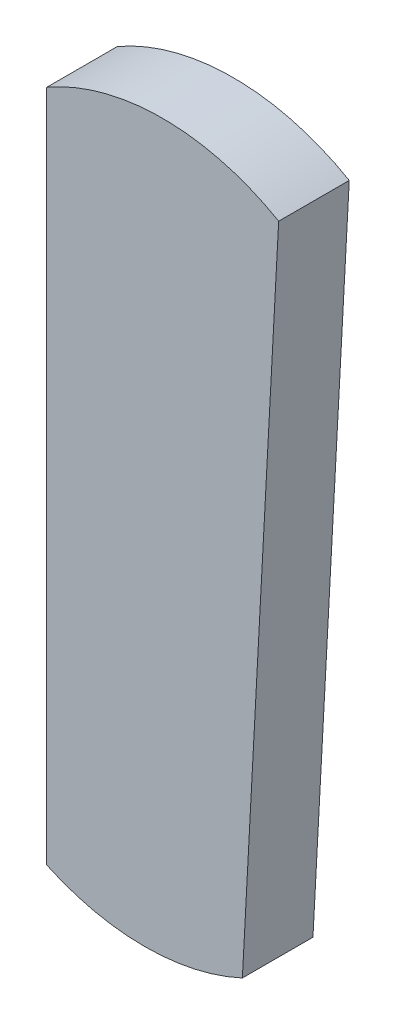
ISO-10303-21;
HEADER;
FILE_DESCRIPTION(('STEP AP214'),'2;1');
FILE_NAME('part.step','',(''),(''),'','','');
FILE_SCHEMA(('AUTOMOTIVE_DESIGN { 1 0 10303 214 1 1 1 1 }'));
ENDSEC;
DATA;
#1=APPLICATION_CONTEXT('core data for automotive mechanical design processes');
#2=APPLICATION_PROTOCOL_DEFINITION('international standard','automotive_design',2000,#1);
#3=PRODUCT_CONTEXT('',#1,'mechanical');
#4=PRODUCT('Part','Part','',(#3));
#5=PRODUCT_RELATED_PRODUCT_CATEGORY('part','',(#4));
#6=PRODUCT_DEFINITION_FORMATION('','',#4);
#7=PRODUCT_DEFINITION_CONTEXT('part definition',#1,'design');
#8=PRODUCT_DEFINITION('design','',#6,#7);
#9=PRODUCT_DEFINITION_SHAPE('','',#8);
#10=(LENGTH_UNIT() NAMED_UNIT(*) SI_UNIT(.MILLI.,.METRE.));
#11=(NAMED_UNIT(*) PLANE_ANGLE_UNIT() SI_UNIT($,.RADIAN.));
#12=(NAMED_UNIT(*) SI_UNIT($,.STERADIAN.) SOLID_ANGLE_UNIT());
#13=UNCERTAINTY_MEASURE_WITH_UNIT(LENGTH_MEASURE(1.E-05),#10,'distance_accuracy_value','');
#14=(GEOMETRIC_REPRESENTATION_CONTEXT(3) GLOBAL_UNCERTAINTY_ASSIGNED_CONTEXT((#13)) GLOBAL_UNIT_ASSIGNED_CONTEXT((#10,
#11,#12)) REPRESENTATION_CONTEXT('',''));
#15=CARTESIAN_POINT('',(0.,0.,0.));
#16=DIRECTION('',(0.,0.,1.));
#17=DIRECTION('',(1.,0.,0.));
#18=AXIS2_PLACEMENT_3D('',#15,#16,#17);
#19=CARTESIAN_POINT('',(11.5,15.9814157129579,7.));
#20=DIRECTION('',(0.,0.,-1.));
#21=DIRECTION('',(-1.,0.,0.));
#22=AXIS2_PLACEMENT_3D('',#19,#20,#21);
#23=CYLINDRICAL_SURFACE('',#22,23.);
#24=CARTESIAN_POINT('',(11.5,15.9814157129579,0.));
#25=DIRECTION('',(0.,0.,1.));
#26=DIRECTION('',(1.,0.,0.));
#27=AXIS2_PLACEMENT_3D('',#24,#25,#26);
#28=CIRCLE('',#27,23.);
#29=CARTESIAN_POINT('',(0.,35.9,0.));
#30=VERTEX_POINT('',#29);
#31=CARTESIAN_POINT('',(23.,35.9,0.));
#32=VERTEX_POINT('',#31);
#33=EDGE_CURVE('E98',#30,#32,#28,.F.);
#34=ORIENTED_EDGE('',*,*,#33,.F.);
#35=DIRECTION('',(0.,0.,-1.));
#36=VECTOR('',#35,1.);
#37=CARTESIAN_POINT('',(0.,35.9,7.));
#38=LINE('',#37,#36);
#39=CARTESIAN_POINT('',(0.,35.9,7.));
#40=VERTEX_POINT('',#39);
#41=EDGE_CURVE('E11',#40,#30,#38,.T.);
#42=ORIENTED_EDGE('',*,*,#41,.F.);
#43=CARTESIAN_POINT('',(11.5,15.9814157129579,7.));
#44=DIRECTION('',(0.,0.,1.));
#45=DIRECTION('',(1.,0.,0.));
#46=AXIS2_PLACEMENT_3D('',#43,#44,#45);
#47=CIRCLE('',#46,23.);
#48=CARTESIAN_POINT('',(23.,35.9,7.));
#49=VERTEX_POINT('',#48);
#50=EDGE_CURVE('E83',#40,#49,#47,.F.);
#51=ORIENTED_EDGE('',*,*,#50,.T.);
#52=DIRECTION('',(0.,0.,-1.));
#53=VECTOR('',#52,1.);
#54=CARTESIAN_POINT('',(23.,35.9,7.));
#55=LINE('',#54,#53);
#56=EDGE_CURVE('E51',#49,#32,#55,.T.);
#57=ORIENTED_EDGE('',*,*,#56,.T.);
#58=EDGE_LOOP('',(#34,#42,#51,#57));
#59=FACE_BOUND('',#58,.T.);
#60=ADVANCED_FACE('F35',(#59),#23,.T.);
#61=CARTESIAN_POINT('',(0.,0.,7.));
#62=DIRECTION('',(1.,0.,0.));
#63=DIRECTION('',(0.,0.,-1.));
#64=AXIS2_PLACEMENT_3D('',#61,#62,#63);
#65=PLANE('',#64);
#66=DIRECTION('',(0.,-1.,0.));
#67=VECTOR('',#66,1.);
#68=CARTESIAN_POINT('',(0.,0.,0.));
#69=LINE('',#68,#67);
#70=CARTESIAN_POINT('',(0.,-30.9,0.));
#71=VERTEX_POINT('',#70);
#72=EDGE_CURVE('E89',#30,#71,#69,.T.);
#73=ORIENTED_EDGE('',*,*,#72,.T.);
#74=DIRECTION('',(0.,0.,-1.));
#75=VECTOR('',#74,1.);
#76=CARTESIAN_POINT('',(0.,-30.9,7.));
#77=LINE('',#76,#75);
#78=CARTESIAN_POINT('',(0.,-30.9,7.));
#79=VERTEX_POINT('',#78);
#80=EDGE_CURVE('E43',#79,#71,#77,.T.);
#81=ORIENTED_EDGE('',*,*,#80,.F.);
#82=DIRECTION('',(0.,-1.,0.));
#83=VECTOR('',#82,1.);
#84=CARTESIAN_POINT('',(0.,0.,7.));
#85=LINE('',#84,#83);
#86=EDGE_CURVE('E77',#40,#79,#85,.T.);
#87=ORIENTED_EDGE('',*,*,#86,.F.);
#88=ORIENTED_EDGE('',*,*,#41,.T.);
#89=EDGE_LOOP('',(#73,#81,#87,#88));
#90=FACE_BOUND('',#89,.T.);
#91=ADVANCED_FACE('F87',(#90),#65,.F.);
#92=CARTESIAN_POINT('',(9.70000000000001,-10.0455040818532,7.));
#93=DIRECTION('',(0.,0.,-1.));
#94=DIRECTION('',(-1.,0.,0.));
#95=AXIS2_PLACEMENT_3D('',#92,#93,#94);
#96=CYLINDRICAL_SURFACE('',#95,23.);
#97=CARTESIAN_POINT('',(9.70000000000001,-10.0455040818532,0.));
#98=DIRECTION('',(0.,0.,1.));
#99=DIRECTION('',(1.,0.,0.));
#100=AXIS2_PLACEMENT_3D('',#97,#98,#99);
#101=CIRCLE('',#100,23.);
#102=CARTESIAN_POINT('',(19.4,-30.9,0.));
#103=VERTEX_POINT('',#102);
#104=EDGE_CURVE('E101',#103,#71,#101,.F.);
#105=ORIENTED_EDGE('',*,*,#104,.F.);
#106=DIRECTION('',(0.,0.,-1.));
#107=VECTOR('',#106,1.);
#108=CARTESIAN_POINT('',(19.4,-30.9,7.));
#109=LINE('',#108,#107);
#110=CARTESIAN_POINT('',(19.4,-30.9,7.));
#111=VERTEX_POINT('',#110);
#112=EDGE_CURVE('E64',#111,#103,#109,.T.);
#113=ORIENTED_EDGE('',*,*,#112,.F.);
#114=CARTESIAN_POINT('',(9.70000000000001,-10.0455040818532,7.));
#115=DIRECTION('',(0.,0.,1.));
#116=DIRECTION('',(1.,0.,0.));
#117=AXIS2_PLACEMENT_3D('',#114,#115,#116);
#118=CIRCLE('',#117,23.);
#119=EDGE_CURVE('E82',#111,#79,#118,.F.);
#120=ORIENTED_EDGE('',*,*,#119,.T.);
#121=ORIENTED_EDGE('',*,*,#80,.T.);
#122=EDGE_LOOP('',(#105,#113,#120,#121));
#123=FACE_BOUND('',#122,.T.);
#124=ADVANCED_FACE('F92',(#123),#96,.T.);
#125=CARTESIAN_POINT('',(21.0042652842331,-1.13196639256346,7.));
#126=DIRECTION('',(0.998550970177739,-0.0538141241413151,0.));
#127=DIRECTION('',(0.0538141241413151,0.998550970177739,0.));
#128=AXIS2_PLACEMENT_3D('',#125,#126,#127);
#129=PLANE('',#128);
#130=DIRECTION('',(-0.0538141241413151,-0.998550970177739,0.));
#131=VECTOR('',#130,1.);
#132=CARTESIAN_POINT('',(21.0042652842331,-1.13196639256346,0.));
#133=LINE('',#132,#131);
#134=EDGE_CURVE('E103',#32,#103,#133,.T.);
#135=ORIENTED_EDGE('',*,*,#134,.F.);
#136=ORIENTED_EDGE('',*,*,#56,.F.);
#137=DIRECTION('',(-0.0538141241413151,-0.998550970177739,0.));
#138=VECTOR('',#137,1.);
#139=CARTESIAN_POINT('',(21.0042652842331,-1.13196639256346,7.));
#140=LINE('',#139,#138);
#141=EDGE_CURVE('E93',#49,#111,#140,.T.);
#142=ORIENTED_EDGE('',*,*,#141,.T.);
#143=ORIENTED_EDGE('',*,*,#112,.T.);
#144=EDGE_LOOP('',(#135,#136,#142,#143));
#145=FACE_BOUND('',#144,.T.);
#146=ADVANCED_FACE('F108',(#145),#129,.T.);
#147=CARTESIAN_POINT('',(0.,0.,7.));
#148=DIRECTION('',(0.,0.,1.));
#149=DIRECTION('',(1.,0.,0.));
#150=AXIS2_PLACEMENT_3D('',#147,#148,#149);
#151=PLANE('',#150);
#152=ORIENTED_EDGE('',*,*,#50,.F.);
#153=ORIENTED_EDGE('',*,*,#86,.T.);
#154=ORIENTED_EDGE('',*,*,#119,.F.);
#155=ORIENTED_EDGE('',*,*,#141,.F.);
#156=EDGE_LOOP('',(#152,#153,#154,#155));
#157=FACE_BOUND('',#156,.T.);
#158=ADVANCED_FACE('F79',(#157),#151,.T.);
#159=CARTESIAN_POINT('',(0.,0.,0.));
#160=DIRECTION('',(0.,0.,1.));
#161=DIRECTION('',(1.,0.,0.));
#162=AXIS2_PLACEMENT_3D('',#159,#160,#161);
#163=PLANE('',#162);
#164=ORIENTED_EDGE('',*,*,#33,.T.);
#165=ORIENTED_EDGE('',*,*,#134,.T.);
#166=ORIENTED_EDGE('',*,*,#104,.T.);
#167=ORIENTED_EDGE('',*,*,#72,.F.);
#168=EDGE_LOOP('',(#164,#165,#166,#167));
#169=FACE_BOUND('',#168,.T.);
#170=ADVANCED_FACE('F115',(#169),#163,.F.);
#171=CLOSED_SHELL('',(#60,#91,#124,#146,#158,#170));
#172=MANIFOLD_SOLID_BREP('B2',#171);
#173=ADVANCED_BREP_SHAPE_REPRESENTATION('',(#18,#172),#14);
#174=SHAPE_DEFINITION_REPRESENTATION(#9,#173);
ENDSEC;
END-ISO-10303-21;
